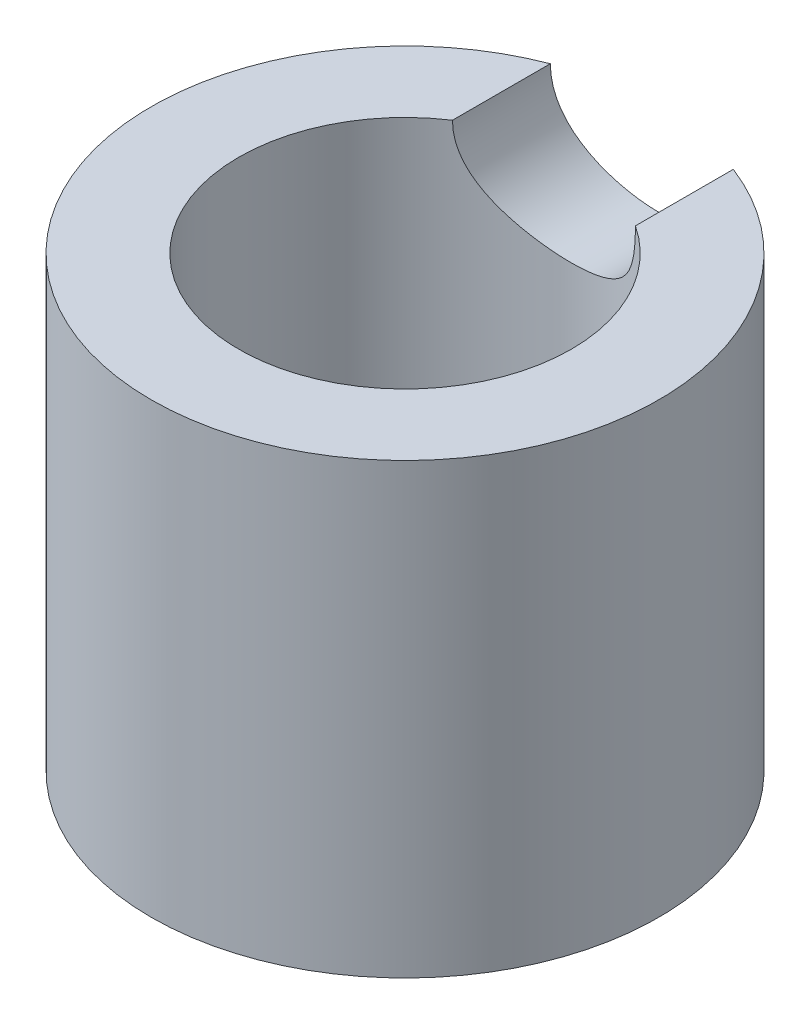
ISO-10303-21;
HEADER;
FILE_DESCRIPTION(('STEP AP214'),'2;1');
FILE_NAME('part.step','',(''),(''),'','','');
FILE_SCHEMA(('AUTOMOTIVE_DESIGN { 1 0 10303 214 1 1 1 1 }'));
ENDSEC;
DATA;
#1=APPLICATION_CONTEXT('core data for automotive mechanical design processes');
#2=APPLICATION_PROTOCOL_DEFINITION('international standard','automotive_design',2000,#1);
#3=PRODUCT_CONTEXT('',#1,'mechanical');
#4=PRODUCT('Part','Part','',(#3));
#5=PRODUCT_RELATED_PRODUCT_CATEGORY('part','',(#4));
#6=PRODUCT_DEFINITION_FORMATION('','',#4);
#7=PRODUCT_DEFINITION_CONTEXT('part definition',#1,'design');
#8=PRODUCT_DEFINITION('design','',#6,#7);
#9=PRODUCT_DEFINITION_SHAPE('','',#8);
#10=(LENGTH_UNIT() NAMED_UNIT(*) SI_UNIT(.MILLI.,.METRE.));
#11=(NAMED_UNIT(*) PLANE_ANGLE_UNIT() SI_UNIT($,.RADIAN.));
#12=(NAMED_UNIT(*) SI_UNIT($,.STERADIAN.) SOLID_ANGLE_UNIT());
#13=UNCERTAINTY_MEASURE_WITH_UNIT(LENGTH_MEASURE(1.E-05),#10,'distance_accuracy_value','');
#14=(GEOMETRIC_REPRESENTATION_CONTEXT(3) GLOBAL_UNCERTAINTY_ASSIGNED_CONTEXT((#13)) GLOBAL_UNIT_ASSIGNED_CONTEXT((#10,
#11,#12)) REPRESENTATION_CONTEXT('',''));
#15=CARTESIAN_POINT('',(0.,0.,0.));
#16=DIRECTION('',(0.,0.,1.));
#17=DIRECTION('',(1.,0.,0.));
#18=AXIS2_PLACEMENT_3D('',#15,#16,#17);
#19=CARTESIAN_POINT('',(0.,51.2,0.));
#20=DIRECTION('',(0.,1.,0.));
#21=DIRECTION('',(0.,0.,1.));
#22=AXIS2_PLACEMENT_3D('',#19,#20,#21);
#23=PLANE('',#22);
#24=DIRECTION('',(0.,0.,1.));
#25=VECTOR('',#24,1.);
#26=CARTESIAN_POINT('',(-10.45,51.2,-29.));
#27=LINE('',#26,#25);
#28=CARTESIAN_POINT('',(-10.45,51.2,-27.0517559504));
#29=VERTEX_POINT('',#28);
#30=CARTESIAN_POINT('',(-10.45,51.2,-15.8681284340656));
#31=VERTEX_POINT('',#30);
#32=EDGE_CURVE('E62',#29,#31,#27,.T.);
#33=ORIENTED_EDGE('',*,*,#32,.F.);
#34=CARTESIAN_POINT('',(0.,51.2,0.));
#35=DIRECTION('',(0.,1.,0.));
#36=DIRECTION('',(0.,0.,1.));
#37=AXIS2_PLACEMENT_3D('',#34,#35,#36);
#38=CIRCLE('',#37,29.);
#39=CARTESIAN_POINT('',(10.45,51.2,-27.0517559504));
#40=VERTEX_POINT('',#39);
#41=EDGE_CURVE('E85',#29,#40,#38,.T.);
#42=ORIENTED_EDGE('',*,*,#41,.T.);
#43=DIRECTION('',(0.,0.,1.));
#44=VECTOR('',#43,1.);
#45=CARTESIAN_POINT('',(10.45,51.2,-29.));
#46=LINE('',#45,#44);
#47=CARTESIAN_POINT('',(10.45,51.2,-15.8681284340656));
#48=VERTEX_POINT('',#47);
#49=EDGE_CURVE('E121',#48,#40,#46,.F.);
#50=ORIENTED_EDGE('',*,*,#49,.F.);
#51=CARTESIAN_POINT('',(0.,51.2,0.));
#52=DIRECTION('',(0.,1.,0.));
#53=DIRECTION('',(0.,0.,1.));
#54=AXIS2_PLACEMENT_3D('',#51,#52,#53);
#55=CIRCLE('',#54,19.);
#56=EDGE_CURVE('E94',#31,#48,#55,.T.);
#57=ORIENTED_EDGE('',*,*,#56,.F.);
#58=EDGE_LOOP('',(#33,#42,#50,#57));
#59=FACE_BOUND('',#58,.T.);
#60=ADVANCED_FACE('F33',(#59),#23,.T.);
#61=CARTESIAN_POINT('',(0.,0.,0.));
#62=DIRECTION('',(0.,1.,0.));
#63=DIRECTION('',(0.,0.,1.));
#64=AXIS2_PLACEMENT_3D('',#61,#62,#63);
#65=PLANE('',#64);
#66=CARTESIAN_POINT('',(0.,0.,0.));
#67=DIRECTION('',(0.,1.,0.));
#68=DIRECTION('',(0.,0.,1.));
#69=AXIS2_PLACEMENT_3D('',#66,#67,#68);
#70=CIRCLE('',#69,29.);
#71=CARTESIAN_POINT('',(-10.45,0.,-27.0517559504));
#72=VERTEX_POINT('',#71);
#73=CARTESIAN_POINT('',(10.45,0.,-27.0517559504));
#74=VERTEX_POINT('',#73);
#75=EDGE_CURVE('E90',#72,#74,#70,.T.);
#76=ORIENTED_EDGE('',*,*,#75,.F.);
#77=DIRECTION('',(0.,0.,1.));
#78=VECTOR('',#77,1.);
#79=CARTESIAN_POINT('',(-10.45,0.,-29.));
#80=LINE('',#79,#78);
#81=CARTESIAN_POINT('',(-10.45,0.,-15.8681284340656));
#82=VERTEX_POINT('',#81);
#83=EDGE_CURVE('E80',#72,#82,#80,.T.);
#84=ORIENTED_EDGE('',*,*,#83,.T.);
#85=CARTESIAN_POINT('',(0.,0.,0.));
#86=DIRECTION('',(0.,1.,0.));
#87=DIRECTION('',(0.,0.,1.));
#88=AXIS2_PLACEMENT_3D('',#85,#86,#87);
#89=CIRCLE('',#88,19.);
#90=CARTESIAN_POINT('',(10.45,0.,-15.8681284340656));
#91=VERTEX_POINT('',#90);
#92=EDGE_CURVE('E88',#82,#91,#89,.T.);
#93=ORIENTED_EDGE('',*,*,#92,.T.);
#94=DIRECTION('',(0.,0.,1.));
#95=VECTOR('',#94,1.);
#96=CARTESIAN_POINT('',(10.45,0.,-29.));
#97=LINE('',#96,#95);
#98=EDGE_CURVE('E55',#91,#74,#97,.F.);
#99=ORIENTED_EDGE('',*,*,#98,.T.);
#100=EDGE_LOOP('',(#76,#84,#93,#99));
#101=FACE_BOUND('',#100,.T.);
#102=ADVANCED_FACE('F87',(#101),#65,.F.);
#103=CARTESIAN_POINT('',(0.,51.2,0.));
#104=DIRECTION('',(0.,-1.,0.));
#105=DIRECTION('',(0.,0.,-1.));
#106=AXIS2_PLACEMENT_3D('',#103,#104,#105);
#107=CYLINDRICAL_SURFACE('',#106,29.);
#108=ORIENTED_EDGE('',*,*,#41,.F.);
#109=CARTESIAN_POINT('',(-10.45,51.2,-27.0517559504));
#110=CARTESIAN_POINT('',(-10.4500420347106,50.9164141954072,-27.0517043468938));
#111=CARTESIAN_POINT('',(-10.4384582900409,50.6328484891242,-27.0562135064838));
#112=CARTESIAN_POINT('',(-10.3923533101106,50.0679492759978,-27.0739748153919));
#113=CARTESIAN_POINT('',(-10.3578392161113,49.7866151017773,-27.0872242426955));
#114=CARTESIAN_POINT('',(-10.2663397274534,49.2291208230481,-27.1220299848386));
#115=CARTESIAN_POINT('',(-10.2094294851695,48.9529466172667,-27.1435585129282));
#116=CARTESIAN_POINT('',(-10.0736989221395,48.4067456528368,-27.1942248619088));
#117=CARTESIAN_POINT('',(-9.99487760715423,48.1367191737498,-27.2233630280918));
#118=CARTESIAN_POINT('',(-9.81612541506079,47.604890681953,-27.2883252534546));
#119=CARTESIAN_POINT('',(-9.71621576569784,47.3430807005817,-27.3241425851209));
#120=CARTESIAN_POINT('',(-9.49602608490442,46.8289327238641,-27.4014434152163));
#121=CARTESIAN_POINT('',(-9.37573845850375,46.5765983030991,-27.4429290251205));
#122=CARTESIAN_POINT('',(-9.11565980665933,46.0828580662941,-27.5304116973908));
#123=CARTESIAN_POINT('',(-8.97585950061417,45.8414575234053,-27.5764109033989));
#124=CARTESIAN_POINT('',(-8.67774496392955,45.371038312997,-27.6716682434378));
#125=CARTESIAN_POINT('',(-8.51942948657004,45.1420204807881,-27.7209265968263));
#126=CARTESIAN_POINT('',(-8.17835321787669,44.6884057396902,-27.8235070049463));
#127=CARTESIAN_POINT('',(-7.99485172295565,44.4643844132757,-27.8769128700475));
#128=CARTESIAN_POINT('',(-7.60999364051447,44.0324216665352,-27.984422606139));
#129=CARTESIAN_POINT('',(-7.40863666352119,43.8244805971454,-28.038526492333));
#130=CARTESIAN_POINT('',(-6.989224552279,43.4258793935119,-28.1460051192097));
#131=CARTESIAN_POINT('',(-6.77116606714592,43.2352227439477,-28.1993797110269));
#132=CARTESIAN_POINT('',(-6.31966720373455,42.8724451862077,-28.30398376654));
#133=CARTESIAN_POINT('',(-6.08622729607372,42.700323711345,-28.355213295789));
#134=CARTESIAN_POINT('',(-5.59776540045548,42.3706717808932,-28.4557396366489));
#135=CARTESIAN_POINT('',(-5.34229576701858,42.213769667686,-28.5049251534369));
#136=CARTESIAN_POINT('',(-4.81819953670833,41.9222128334194,-28.598177522385));
#137=CARTESIAN_POINT('',(-4.54957824539634,41.7875492353605,-28.6422464148639));
#138=CARTESIAN_POINT('',(-4.00093046659109,41.5415619344381,-28.7240224277536));
#139=CARTESIAN_POINT('',(-3.72090469945482,41.4302367601392,-28.7617299492052));
#140=CARTESIAN_POINT('',(-3.15147124006535,41.231970836778,-28.829679557322));
#141=CARTESIAN_POINT('',(-2.86206402532538,41.1450288487852,-28.8599220232835));
#142=CARTESIAN_POINT('',(-2.2878549349811,40.9993921327907,-28.9109917080171));
#143=CARTESIAN_POINT('',(-2.00333408881766,40.9397041116403,-28.9321479733921));
#144=CARTESIAN_POINT('',(-1.42982129044733,40.8441991641431,-28.9661546281748));
#145=CARTESIAN_POINT('',(-1.1408294473127,40.8083816563995,-28.9790052198775));
#146=CARTESIAN_POINT('',(-0.560678879709498,40.7609949871443,-28.9960313858068));
#147=CARTESIAN_POINT('',(-0.269520689891145,40.7494200296107,-29.0002090335992));
#148=CARTESIAN_POINT('',(0.312734806425997,40.7506246465023,-28.9997748676108));
#149=CARTESIAN_POINT('',(0.603832114382951,40.7634035489806,-28.9951632963333));
#150=CARTESIAN_POINT('',(1.17038196262185,40.8120354464162,-28.9776953432902));
#151=CARTESIAN_POINT('',(1.44594031930987,40.8468046299265,-28.9652263232188));
#152=CARTESIAN_POINT('',(1.99297364278444,40.9380584371896,-28.9327345282788));
#153=CARTESIAN_POINT('',(2.26444875680151,40.9945422760117,-28.9127120264502));
#154=CARTESIAN_POINT('',(2.80148216586523,41.1287138066125,-28.865625989761));
#155=CARTESIAN_POINT('',(3.06704032483467,41.2064019855021,-28.8385622931492));
#156=CARTESIAN_POINT('',(3.59051770846456,41.3823153444254,-28.7780752435371));
#157=CARTESIAN_POINT('',(3.84843674464675,41.480541030695,-28.7446517337734));
#158=CARTESIAN_POINT('',(4.35857346083339,41.6982467749626,-28.6717657468143));
#159=CARTESIAN_POINT('',(4.61066189598389,41.8180035257151,-28.6322257208561));
#160=CARTESIAN_POINT('',(5.10393720166782,42.0769548805522,-28.5484227923349));
#161=CARTESIAN_POINT('',(5.34512009308556,42.2161565049481,-28.5041581853929));
#162=CARTESIAN_POINT('',(5.8151378714156,42.5130019144401,-28.411996307252));
#163=CARTESIAN_POINT('',(6.04397205581615,42.6706467471483,-28.3640988297529));
#164=CARTESIAN_POINT('',(6.48804335191334,43.0033677864734,-28.2658277976439));
#165=CARTESIAN_POINT('',(6.70327959286285,43.1784451075379,-28.2154540848342));
#166=CARTESIAN_POINT('',(7.13029934974789,43.5549560262958,-28.1106697752737));
#167=CARTESIAN_POINT('',(7.3412592784425,43.7573049611028,-28.0561885814523));
#168=CARTESIAN_POINT('',(7.74550895494482,44.1789671559337,-27.947288313059));
#169=CARTESIAN_POINT('',(7.9387981319775,44.3982809635103,-27.8928692405497));
#170=CARTESIAN_POINT('',(8.30657087260514,44.8526511640103,-27.7855645190033));
#171=CARTESIAN_POINT('',(8.48104707362154,45.0877136623549,-27.7326794761947));
#172=CARTESIAN_POINT('',(8.80993426692912,45.5721004668433,-27.6299610342489));
#173=CARTESIAN_POINT('',(8.96434614832552,45.8214241403297,-27.5801274999428));
#174=CARTESIAN_POINT('',(9.25486016428928,46.3379432978285,-27.4840217354911));
#175=CARTESIAN_POINT('',(9.39053562890229,46.6053960717039,-27.43784037231));
#176=CARTESIAN_POINT('',(9.63865789391978,47.1516996773991,-27.3516640412208));
#177=CARTESIAN_POINT('',(9.75111447705434,47.4305456493991,-27.311666469709));
#178=CARTESIAN_POINT('',(9.95170746000071,47.9974526394747,-27.2392162699204));
#179=CARTESIAN_POINT('',(10.0398714660334,48.2855027788086,-27.2067550839143));
#180=CARTESIAN_POINT('',(10.1911151141635,48.8688149965805,-27.1504632228316));
#181=CARTESIAN_POINT('',(10.2542061224131,49.1640737426149,-27.1266286375619));
#182=CARTESIAN_POINT('',(10.3527968321001,49.7485837187473,-27.0891570823594));
#183=CARTESIAN_POINT('',(10.3892264665924,50.037656165093,-27.0751771130261));
#184=CARTESIAN_POINT('',(10.43783778974,50.6178112310461,-27.0564531568833));
#185=CARTESIAN_POINT('',(10.4500455895101,50.9088913462169,-27.0516992245359));
#186=CARTESIAN_POINT('',(10.45,51.2,-27.0517559504));
#187=B_SPLINE_CURVE_WITH_KNOTS('',3,(#109,#110,#111,#112,#113,#114,#115,#116,#117,#118,#119,
#120,#121,#122,#123,#124,#125,#126,#127,#128,#129,#130,#131,#132,#133,#134,#135,#136,#137,#138,
#139,#140,#141,#142,#143,#144,#145,#146,#147,#148,#149,#150,#151,#152,#153,#154,#155,#156,#157,
#158,#159,#160,#161,#162,#163,#164,#165,#166,#167,#168,#169,#170,#171,#172,#173,#174,#175,#176,
#177,#178,#179,#180,#181,#182,#183,#184,#185,#186),.UNSPECIFIED.,.F.,.F.,(4,2,2,2,2,2,2,2,2,2,2,
2,2,2,2,2,2,2,2,2,2,2,2,2,2,2,2,2,2,2,2,2,2,2,2,2,2,2,4),(0.,0.850453833766536,1.70064293244988,
2.54800314028429,3.39540180430426,4.24195150128672,5.08881740836093,5.93608748226968,
6.78341464003721,7.66582218735498,8.54824898694583,9.43085329714968,10.3134306152938,
11.223737519741,12.133680171924,13.0435654369885,13.9534044616266,14.8267426200457,
15.7000595064272,16.5731675722934,17.4462515486034,18.2793406273302,19.1123995947931,
19.9454777010853,20.7785763446223,21.6232656368351,22.4682606848241,23.3133037535895,
24.1584008801308,25.0494334564846,25.9404948035209,26.8319036170085,27.7232729162381,
28.6324226357712,29.5411885212372,30.4489173803231,31.3562342748872,32.230161380644,
33.1031458808551),.UNSPECIFIED.);
#188=EDGE_CURVE('E95',#29,#40,#187,.T.);
#189=ORIENTED_EDGE('',*,*,#188,.T.);
#190=EDGE_LOOP('',(#108,#189));
#191=FACE_BOUND('',#190,.T.);
#192=ORIENTED_EDGE('',*,*,#75,.T.);
#193=CARTESIAN_POINT('',(10.45,0.,-27.0517559504));
#194=CARTESIAN_POINT('',(10.4500420347106,0.283585804592823,-27.0517043468938));
#195=CARTESIAN_POINT('',(10.4384582900409,0.567151510875765,-27.0562135064838));
#196=CARTESIAN_POINT('',(10.3923533101106,1.13205072400223,-27.0739748153919));
#197=CARTESIAN_POINT('',(10.3578392161113,1.41338489822269,-27.0872242426955));
#198=CARTESIAN_POINT('',(10.2663397274534,1.97087917695194,-27.1220299848386));
#199=CARTESIAN_POINT('',(10.2094294851695,2.24705338273331,-27.1435585129283));
#200=CARTESIAN_POINT('',(10.0736989221395,2.79325434716323,-27.1942248619088));
#201=CARTESIAN_POINT('',(9.99487760715423,3.06328082625018,-27.2233630280918));
#202=CARTESIAN_POINT('',(9.81612541506079,3.59510931804701,-27.2883252534546));
#203=CARTESIAN_POINT('',(9.71621576569784,3.85691929941826,-27.3241425851209));
#204=CARTESIAN_POINT('',(9.49602608490443,4.37106727613591,-27.4014434152163));
#205=CARTESIAN_POINT('',(9.37573845850376,4.62340169690089,-27.4429290251205));
#206=CARTESIAN_POINT('',(9.11565980665934,5.11714193370589,-27.5304116973908));
#207=CARTESIAN_POINT('',(8.97585950061418,5.35854247659465,-27.5764109033989));
#208=CARTESIAN_POINT('',(8.67774496392956,5.82896168700296,-27.6716682434378));
#209=CARTESIAN_POINT('',(8.51942948657005,6.05797951921194,-27.7209265968263));
#210=CARTESIAN_POINT('',(8.1783532178767,6.51159426030976,-27.8235070049463));
#211=CARTESIAN_POINT('',(7.99485172295566,6.73561558672429,-27.8769128700475));
#212=CARTESIAN_POINT('',(7.60999364051448,7.16757833346485,-27.984422606139));
#213=CARTESIAN_POINT('',(7.4086366635212,7.37551940285456,-28.038526492333));
#214=CARTESIAN_POINT('',(6.98922455227901,7.77412060648809,-28.1460051192098));
#215=CARTESIAN_POINT('',(6.77116606714592,7.96477725605234,-28.1993797110269));
#216=CARTESIAN_POINT('',(6.31966720373456,8.32755481379228,-28.30398376654));
#217=CARTESIAN_POINT('',(6.08622729607372,8.49967628865505,-28.355213295789));
#218=CARTESIAN_POINT('',(5.59776540045549,8.82932821910676,-28.4557396366489));
#219=CARTESIAN_POINT('',(5.34229576701858,8.986230332314,-28.5049251534368));
#220=CARTESIAN_POINT('',(4.81819953670834,9.27778716658057,-28.598177522385));
#221=CARTESIAN_POINT('',(4.54957824539635,9.41245076463952,-28.6422464148639));
#222=CARTESIAN_POINT('',(4.0009304665911,9.65843806556188,-28.7240224277536));
#223=CARTESIAN_POINT('',(3.72090469945483,9.76976323986082,-28.7617299492052));
#224=CARTESIAN_POINT('',(3.15147124006535,9.96802916322205,-28.829679557322));
#225=CARTESIAN_POINT('',(2.86206402532538,10.0549711512148,-28.8599220232835));
#226=CARTESIAN_POINT('',(2.28785493498111,10.2006078672093,-28.9109917080171));
#227=CARTESIAN_POINT('',(2.00333408881766,10.2602958883597,-28.9321479733921));
#228=CARTESIAN_POINT('',(1.42982129044734,10.3558008358569,-28.9661546281748));
#229=CARTESIAN_POINT('',(1.14082944731271,10.3916183436005,-28.9790052198775));
#230=CARTESIAN_POINT('',(0.560678879709506,10.4390050128558,-28.9960313858068));
#231=CARTESIAN_POINT('',(0.269520689891153,10.4505799703893,-29.0002090335992));
#232=CARTESIAN_POINT('',(-0.31273480642599,10.4493753534977,-28.9997748676108));
#233=CARTESIAN_POINT('',(-0.603832114382944,10.4365964510194,-28.9951632963333));
#234=CARTESIAN_POINT('',(-1.17038196262185,10.3879645535838,-28.9776953432902));
#235=CARTESIAN_POINT('',(-1.44594031930986,10.3531953700735,-28.9652263232188));
#236=CARTESIAN_POINT('',(-1.99297364278444,10.2619415628104,-28.9327345282788));
#237=CARTESIAN_POINT('',(-2.2644487568015,10.2054577239883,-28.9127120264502));
#238=CARTESIAN_POINT('',(-2.80148216586523,10.0712861933875,-28.865625989761));
#239=CARTESIAN_POINT('',(-3.06704032483466,9.99359801449789,-28.8385622931492));
#240=CARTESIAN_POINT('',(-3.59051770846455,9.81768465557462,-28.7780752435371));
#241=CARTESIAN_POINT('',(-3.84843674464674,9.71945896930502,-28.7446517337734));
#242=CARTESIAN_POINT('',(-4.35857346083338,9.50175322503744,-28.6717657468143));
#243=CARTESIAN_POINT('',(-4.61066189598388,9.3819964742849,-28.6322257208561));
#244=CARTESIAN_POINT('',(-5.10393720166782,9.12304511944778,-28.5484227923349));
#245=CARTESIAN_POINT('',(-5.34512009308555,8.98384349505191,-28.5041581853929));
#246=CARTESIAN_POINT('',(-5.81513787141559,8.68699808555991,-28.411996307252));
#247=CARTESIAN_POINT('',(-6.04397205581614,8.52935325285172,-28.3640988297529));
#248=CARTESIAN_POINT('',(-6.48804335191334,8.1966322135266,-28.2658277976439));
#249=CARTESIAN_POINT('',(-6.70327959286284,8.02155489246214,-28.2154540848342));
#250=CARTESIAN_POINT('',(-7.13029934974788,7.64504397370423,-28.1106697752738));
#251=CARTESIAN_POINT('',(-7.34125927844249,7.44269503889725,-28.0561885814523));
#252=CARTESIAN_POINT('',(-7.74550895494482,7.02103284406633,-27.947288313059));
#253=CARTESIAN_POINT('',(-7.9387981319775,6.80171903648976,-27.8928692405497));
#254=CARTESIAN_POINT('',(-8.30657087260514,6.34734883598967,-27.7855645190033));
#255=CARTESIAN_POINT('',(-8.48104707362154,6.11228633764513,-27.7326794761947));
#256=CARTESIAN_POINT('',(-8.80993426692911,5.62789953315669,-27.6299610342489));
#257=CARTESIAN_POINT('',(-8.96434614832551,5.3785758596703,-27.5801274999428));
#258=CARTESIAN_POINT('',(-9.25486016428927,4.86205670217147,-27.4840217354911));
#259=CARTESIAN_POINT('',(-9.39053562890229,4.59460392829616,-27.43784037231));
#260=CARTESIAN_POINT('',(-9.63865789391978,4.04830032260089,-27.3516640412208));
#261=CARTESIAN_POINT('',(-9.75111447705434,3.76945435060087,-27.311666469709));
#262=CARTESIAN_POINT('',(-9.9517074600007,3.20254736052535,-27.2392162699204));
#263=CARTESIAN_POINT('',(-10.0398714660334,2.91449722119139,-27.2067550839143));
#264=CARTESIAN_POINT('',(-10.1911151141635,2.33118500341955,-27.1504632228316));
#265=CARTESIAN_POINT('',(-10.2542061224131,2.03592625738507,-27.1266286375619));
#266=CARTESIAN_POINT('',(-10.3527968321001,1.45141628125275,-27.0891570823594));
#267=CARTESIAN_POINT('',(-10.3892264665924,1.16234383490704,-27.0751771130261));
#268=CARTESIAN_POINT('',(-10.43783778974,0.58218876895395,-27.0564531568833));
#269=CARTESIAN_POINT('',(-10.4500455895101,0.291108653783103,-27.0516992245359));
#270=CARTESIAN_POINT('',(-10.45,0.,-27.0517559504));
#271=B_SPLINE_CURVE_WITH_KNOTS('',3,(#193,#194,#195,#196,#197,#198,#199,#200,#201,#202,#203,
#204,#205,#206,#207,#208,#209,#210,#211,#212,#213,#214,#215,#216,#217,#218,#219,#220,#221,#222,
#223,#224,#225,#226,#227,#228,#229,#230,#231,#232,#233,#234,#235,#236,#237,#238,#239,#240,#241,
#242,#243,#244,#245,#246,#247,#248,#249,#250,#251,#252,#253,#254,#255,#256,#257,#258,#259,#260,
#261,#262,#263,#264,#265,#266,#267,#268,#269,#270),.UNSPECIFIED.,.F.,.F.,(4,2,2,2,2,2,2,2,2,2,2,
2,2,2,2,2,2,2,2,2,2,2,2,2,2,2,2,2,2,2,2,2,2,2,2,2,2,2,4),(0.,0.850453833766532,1.70064293244988,
2.54800314028428,3.39540180430426,4.24195150128671,5.08881740836092,5.93608748226966,
6.7834146400372,7.66582218735498,8.54824898694583,9.43085329714968,10.3134306152938,
11.223737519741,12.133680171924,13.0435654369885,13.9534044616266,14.8267426200457,
15.7000595064273,16.5731675722934,17.4462515486034,18.2793406273302,19.1123995947931,
19.9454777010853,20.7785763446223,21.6232656368351,22.4682606848241,23.3133037535895,
24.1584008801308,25.0494334564846,25.9404948035209,26.8319036170085,27.7232729162381,
28.6324226357712,29.5411885212372,30.4489173803231,31.3562342748872,32.230161380644,
33.1031458808552),.UNSPECIFIED.);
#272=EDGE_CURVE('E91',#74,#72,#271,.T.);
#273=ORIENTED_EDGE('',*,*,#272,.T.);
#274=EDGE_LOOP('',(#192,#273));
#275=FACE_BOUND('',#274,.T.);
#276=ADVANCED_FACE('F35',(#191,#275),#107,.T.);
#277=CARTESIAN_POINT('',(0.,51.2,0.));
#278=DIRECTION('',(0.,-1.,0.));
#279=DIRECTION('',(0.,0.,-1.));
#280=AXIS2_PLACEMENT_3D('',#277,#278,#279);
#281=CYLINDRICAL_SURFACE('',#280,19.);
#282=CARTESIAN_POINT('',(-10.45,51.2,-15.8681284340656));
#283=CARTESIAN_POINT('',(-10.4500012730181,51.0653833149891,-15.8681246559729));
#284=CARTESIAN_POINT('',(-10.4473981935161,50.9307864478376,-15.8698422115779));
#285=CARTESIAN_POINT('',(-10.4370032538798,50.6618869862102,-15.8766816326083));
#286=CARTESIAN_POINT('',(-10.4292116748264,50.5275843761886,-15.8818033136192));
#287=CARTESIAN_POINT('',(-10.3981046596639,50.1257493900968,-15.9022035166576));
#288=CARTESIAN_POINT('',(-10.3670568574151,49.8590162589393,-15.9225173529007));
#289=CARTESIAN_POINT('',(-10.2850919997626,49.3318171395036,-15.9755820898262));
#290=CARTESIAN_POINT('',(-10.2343115002847,49.0713208671769,-16.0082474732981));
#291=CARTESIAN_POINT('',(-10.1135634255716,48.5564693719258,-16.0848045161732));
#292=CARTESIAN_POINT('',(-10.0435929241274,48.3021150920111,-16.12869788762));
#293=CARTESIAN_POINT('',(-9.88553018246522,47.8018502283056,-16.2260552771701));
#294=CARTESIAN_POINT('',(-9.79749089995467,47.5559173660677,-16.2794912687168));
#295=CARTESIAN_POINT('',(-9.60403995683278,47.0729436946843,-16.3943606685431));
#296=CARTESIAN_POINT('',(-9.49862864822693,46.8359027054843,-16.4557939147708));
#297=CARTESIAN_POINT('',(-9.27108162313205,46.3712752819912,-16.5850592272797));
#298=CARTESIAN_POINT('',(-9.14891684383235,46.1437061932698,-16.6529023479392));
#299=CARTESIAN_POINT('',(-8.88879269546811,45.6992566003047,-16.7931891214218));
#300=CARTESIAN_POINT('',(-8.75083177189294,45.482377151046,-16.8656332267182));
#301=CARTESIAN_POINT('',(-8.44524660649842,45.0388371524624,-17.0208707913538));
#302=CARTESIAN_POINT('',(-8.27603504615457,44.813377165401,-17.1039735239912));
#303=CARTESIAN_POINT('',(-7.92025692286623,44.3771517454434,-17.2716010378501));
#304=CARTESIAN_POINT('',(-7.73368933213889,44.1663871840702,-17.356125903044));
#305=CARTESIAN_POINT('',(-7.34394254747332,43.7603610419234,-17.5245996758007));
#306=CARTESIAN_POINT('',(-7.14075577283886,43.5651066169124,-17.6085483013791));
#307=CARTESIAN_POINT('',(-6.71875429802651,43.1912371415642,-17.7738481776533));
#308=CARTESIAN_POINT('',(-6.49994473541626,43.0126166652579,-17.8552002696029));
#309=CARTESIAN_POINT('',(-6.02796580951804,42.6583052928639,-18.0203050555937));
#310=CARTESIAN_POINT('',(-5.77346113451381,42.4842006174535,-18.1036579714908));
#311=CARTESIAN_POINT('',(-5.24829903158589,42.1582431644075,-18.262821138262));
#312=CARTESIAN_POINT('',(-4.97764042634378,42.0063920114297,-18.3386308383007));
#313=CARTESIAN_POINT('',(-4.42196345972371,41.7265930463403,-18.4804871163755));
#314=CARTESIAN_POINT('',(-4.13695324241697,41.5986318672827,-18.5465391496878));
#315=CARTESIAN_POINT('',(-3.55446192453808,41.3680942773136,-18.6669279387466));
#316=CARTESIAN_POINT('',(-3.25698249065588,41.2655144863877,-18.7212662542732));
#317=CARTESIAN_POINT('',(-2.67716156036428,41.0946097581584,-18.8125395654125));
#318=CARTESIAN_POINT('',(-2.39561869371007,41.0241454583119,-18.8505461022332));
#319=CARTESIAN_POINT('',(-1.82629028871861,40.9067196174583,-18.9141925377618));
#320=CARTESIAN_POINT('',(-1.53850506778543,40.8597568843797,-18.9398330637093));
#321=CARTESIAN_POINT('',(-0.959332065107866,40.7900428826343,-18.9779834579204));
#322=CARTESIAN_POINT('',(-0.667946639160716,40.7672765502572,-18.9905014956532));
#323=CARTESIAN_POINT('',(-0.0840349414601812,40.7462559718408,-19.0020572982258));
#324=CARTESIAN_POINT('',(0.208491238125644,40.7479997849005,-19.0010961304523));
#325=CARTESIAN_POINT('',(0.761381928150848,40.7744937192387,-18.986537018077));
#326=CARTESIAN_POINT('',(1.02190258118581,40.796812366127,-18.97427465686));
#327=CARTESIAN_POINT('',(1.53982717952239,40.8607784045931,-18.9392788647418));
#328=CARTESIAN_POINT('',(1.79723139030732,40.9024241376779,-18.9165463323066));
#329=CARTESIAN_POINT('',(2.30717744119805,41.0045568521245,-18.8611432232997));
#330=CARTESIAN_POINT('',(2.5597191899388,41.0650441871515,-18.8284724601834));
#331=CARTESIAN_POINT('',(3.05834942150661,41.2042006089911,-18.7539343956568));
#332=CARTESIAN_POINT('',(3.30443765326291,41.2828704020179,-18.7120667370384));
#333=CARTESIAN_POINT('',(3.79129051288055,41.4585271755928,-18.6195639348381));
#334=CARTESIAN_POINT('',(4.03197210941065,41.5556978168595,-18.5688413468723));
#335=CARTESIAN_POINT('',(4.50414244029669,41.7669661949012,-18.4599953673567));
#336=CARTESIAN_POINT('',(4.73562783881112,41.881070004232,-18.4018693218507));
#337=CARTESIAN_POINT('',(5.18824121521788,42.1252674186986,-18.279417775016));
#338=CARTESIAN_POINT('',(5.40937044515481,42.2553590839996,-18.215093025991));
#339=CARTESIAN_POINT('',(5.8404943223379,42.5307105559795,-18.0814707607809));
#340=CARTESIAN_POINT('',(6.05048492934415,42.6759758105097,-18.0121714613699));
#341=CARTESIAN_POINT('',(6.48046570029448,42.9972185556614,-17.8622736907849));
#342=CARTESIAN_POINT('',(6.69910080414365,43.174818839879,-17.781261737982));
#343=CARTESIAN_POINT('',(7.12080538383843,43.546527105727,-17.6166222801085));
#344=CARTESIAN_POINT('',(7.32387371151187,43.7406363027964,-17.5329945827455));
#345=CARTESIAN_POINT('',(7.71384060763867,44.1446419237716,-17.3649587686544));
#346=CARTESIAN_POINT('',(7.90071979251649,44.3545567252083,-17.2805498467567));
#347=CARTESIAN_POINT('',(8.2572086769888,44.7890731994456,-17.1130738002932));
#348=CARTESIAN_POINT('',(8.42681820307708,45.0136750197678,-17.0300066892155));
#349=CARTESIAN_POINT('',(8.76216156562718,45.4972712232828,-16.8600984974949));
#350=CARTESIAN_POINT('',(8.92621372321557,45.7575485702563,-16.773577332291));
#351=CARTESIAN_POINT('',(9.23157338358674,46.293308113382,-16.6074766862903));
#352=CARTESIAN_POINT('',(9.37287755167582,46.5687925308484,-16.5278982240262));
#353=CARTESIAN_POINT('',(9.63098465736376,47.1327465828359,-16.3788369713242));
#354=CARTESIAN_POINT('',(9.74785006769433,47.4211807604486,-16.3093285822235));
#355=CARTESIAN_POINT('',(9.95602284359848,48.0097882905724,-16.1830919535635));
#356=CARTESIAN_POINT('',(10.0473407557039,48.309956740435,-16.1263584421653));
#357=CARTESIAN_POINT('',(10.1785121378221,48.8236751008197,-16.0437477570263));
#358=CARTESIAN_POINT('',(10.2255185262193,49.0347704625161,-16.0137780908027));
#359=CARTESIAN_POINT('',(10.3064606327971,49.4603823158968,-15.9618037153635));
#360=CARTESIAN_POINT('',(10.3404001006948,49.6748978077028,-15.9397967212684));
#361=CARTESIAN_POINT('',(10.3949890356453,50.1071568553254,-15.9042551230562));
#362=CARTESIAN_POINT('',(10.4155869370567,50.3249096474307,-15.8907533975621));
#363=CARTESIAN_POINT('',(10.443108726044,50.7617680737177,-15.8726660496449));
#364=CARTESIAN_POINT('',(10.4500248155989,50.9808744080409,-15.8680855119231));
#365=CARTESIAN_POINT('',(10.45,51.2,-15.8681284340656));
#366=B_SPLINE_CURVE_WITH_KNOTS('',3,(#282,#283,#284,#285,#286,#287,#288,#289,#290,#291,#292,
#293,#294,#295,#296,#297,#298,#299,#300,#301,#302,#303,#304,#305,#306,#307,#308,#309,#310,#311,
#312,#313,#314,#315,#316,#317,#318,#319,#320,#321,#322,#323,#324,#325,#326,#327,#328,#329,#330,
#331,#332,#333,#334,#335,#336,#337,#338,#339,#340,#341,#342,#343,#344,#345,#346,#347,#348,#349,
#350,#351,#352,#353,#354,#355,#356,#357,#358,#359,#360,#361,#362,#363,#364,#365),.UNSPECIFIED.,
.F.,.F.,(4,2,2,2,2,2,2,2,2,2,2,2,2,2,2,2,2,2,2,2,2,2,2,2,2,2,2,2,2,2,2,2,2,2,2,2,2,2,2,2,2,4),
(0.,0.403774900877862,0.807527929500475,1.61421634347208,2.41541890435949,3.21674370550549,
4.01575261388323,4.81474533411242,5.61514205241605,6.41561760618315,7.29637563173928,
8.17718584693271,9.05840010095439,9.93932588987509,10.896356113444,11.853456171935,
12.8100190971677,13.7664545692164,14.6433457334633,15.5201924145922,16.3964928857487,
17.2727239651172,18.0570787544756,18.8413662493439,19.6256684665201,20.4100011514402,
21.202569498715,21.9954227660016,22.7881799298052,23.5812227060215,24.4595921876933,
25.338026393811,26.2174982342825,27.0969789098323,28.0545593291095,29.0122799953022,
29.9675216788514,30.92236843516,31.5768566276699,32.2311568663348,32.8879711427837,
33.5451596662769),.UNSPECIFIED.);
#367=EDGE_CURVE('E11',#31,#48,#366,.T.);
#368=ORIENTED_EDGE('',*,*,#367,.F.);
#369=ORIENTED_EDGE('',*,*,#56,.T.);
#370=EDGE_LOOP('',(#368,#369));
#371=FACE_BOUND('',#370,.T.);
#372=CARTESIAN_POINT('',(10.45,0.,-15.8681284340656));
#373=CARTESIAN_POINT('',(10.4500012730181,0.13461668501087,-15.8681246559729));
#374=CARTESIAN_POINT('',(10.4473981935161,0.269213552162404,-15.8698422115779));
#375=CARTESIAN_POINT('',(10.4370032538798,0.53811301378984,-15.8766816326083));
#376=CARTESIAN_POINT('',(10.4292116748264,0.672415623811373,-15.8818033136192));
#377=CARTESIAN_POINT('',(10.3981046596639,1.07425060990325,-15.9022035166576));
#378=CARTESIAN_POINT('',(10.3670568574151,1.34098374106069,-15.9225173529007));
#379=CARTESIAN_POINT('',(10.2850919997626,1.86818286049645,-15.9755820898262));
#380=CARTESIAN_POINT('',(10.2343115002847,2.12867913282309,-16.0082474732981));
#381=CARTESIAN_POINT('',(10.1135634255716,2.6435306280742,-16.0848045161732));
#382=CARTESIAN_POINT('',(10.0435929241274,2.89788490798894,-16.1286978876201));
#383=CARTESIAN_POINT('',(9.88553018246523,3.39814977169438,-16.2260552771701));
#384=CARTESIAN_POINT('',(9.79749089995467,3.64408263393227,-16.2794912687168));
#385=CARTESIAN_POINT('',(9.60403995683278,4.12705630531565,-16.3943606685431));
#386=CARTESIAN_POINT('',(9.49862864822693,4.36409729451573,-16.4557939147708));
#387=CARTESIAN_POINT('',(9.27108162313205,4.82872471800875,-16.5850592272797));
#388=CARTESIAN_POINT('',(9.14891684383235,5.0562938067302,-16.6529023479392));
#389=CARTESIAN_POINT('',(8.88879269546811,5.50074339969534,-16.7931891214218));
#390=CARTESIAN_POINT('',(8.75083177189294,5.71762284895399,-16.8656332267182));
#391=CARTESIAN_POINT('',(8.44524660649842,6.16116284753757,-17.0208707913538));
#392=CARTESIAN_POINT('',(8.27603504615457,6.38662283459905,-17.1039735239912));
#393=CARTESIAN_POINT('',(7.92025692286624,6.82284825455657,-17.2716010378501));
#394=CARTESIAN_POINT('',(7.73368933213889,7.03361281592981,-17.356125903044));
#395=CARTESIAN_POINT('',(7.34394254747332,7.43963895807659,-17.5245996758007));
#396=CARTESIAN_POINT('',(7.14075577283886,7.63489338308758,-17.6085483013791));
#397=CARTESIAN_POINT('',(6.71875429802652,8.00876285843584,-17.7738481776533));
#398=CARTESIAN_POINT('',(6.49994473541626,8.18738333474212,-17.8552002696029));
#399=CARTESIAN_POINT('',(6.02796580951805,8.54169470713606,-18.0203050555937));
#400=CARTESIAN_POINT('',(5.77346113451382,8.71579938254646,-18.1036579714908));
#401=CARTESIAN_POINT('',(5.2482990315859,9.04175683559255,-18.262821138262));
#402=CARTESIAN_POINT('',(4.97764042634378,9.19360798857028,-18.3386308383007));
#403=CARTESIAN_POINT('',(4.42196345972371,9.47340695365971,-18.4804871163755));
#404=CARTESIAN_POINT('',(4.13695324241697,9.60136813271735,-18.5465391496878));
#405=CARTESIAN_POINT('',(3.55446192453809,9.83190572268642,-18.6669279387466));
#406=CARTESIAN_POINT('',(3.25698249065589,9.93448551361228,-18.7212662542732));
#407=CARTESIAN_POINT('',(2.67716156036429,10.1053902418416,-18.8125395654125));
#408=CARTESIAN_POINT('',(2.39561869371007,10.1758545416881,-18.8505461022332));
#409=CARTESIAN_POINT('',(1.82629028871862,10.2932803825418,-18.9141925377618));
#410=CARTESIAN_POINT('',(1.53850506778544,10.3402431156203,-18.9398330637093));
#411=CARTESIAN_POINT('',(0.959332065107871,10.4099571173657,-18.9779834579204));
#412=CARTESIAN_POINT('',(0.667946639160721,10.4327234497428,-18.9905014956532));
#413=CARTESIAN_POINT('',(0.0840349414601844,10.4537440281592,-19.0020572982258));
#414=CARTESIAN_POINT('',(-0.208491238125641,10.4520002150995,-19.0010961304523));
#415=CARTESIAN_POINT('',(-0.761381928150845,10.4255062807613,-18.986537018077));
#416=CARTESIAN_POINT('',(-1.02190258118581,10.403187633873,-18.97427465686));
#417=CARTESIAN_POINT('',(-1.53982717952239,10.3392215954069,-18.9392788647418));
#418=CARTESIAN_POINT('',(-1.79723139030732,10.2975758623221,-18.9165463323066));
#419=CARTESIAN_POINT('',(-2.30717744119805,10.1954431478755,-18.8611432232997));
#420=CARTESIAN_POINT('',(-2.55971918993879,10.1349558128485,-18.8284724601834));
#421=CARTESIAN_POINT('',(-3.05834942150661,9.9957993910089,-18.7539343956568));
#422=CARTESIAN_POINT('',(-3.30443765326291,9.9171295979821,-18.7120667370384));
#423=CARTESIAN_POINT('',(-3.79129051288054,9.74147282440722,-18.6195639348381));
#424=CARTESIAN_POINT('',(-4.03197210941065,9.64430218314055,-18.5688413468723));
#425=CARTESIAN_POINT('',(-4.50414244029669,9.4330338050988,-18.4599953673567));
#426=CARTESIAN_POINT('',(-4.73562783881112,9.31892999576797,-18.4018693218507));
#427=CARTESIAN_POINT('',(-5.18824121521788,9.07473258130145,-18.279417775016));
#428=CARTESIAN_POINT('',(-5.40937044515481,8.94464091600042,-18.215093025991));
#429=CARTESIAN_POINT('',(-5.8404943223379,8.66928944402046,-18.0814707607809));
#430=CARTESIAN_POINT('',(-6.05048492934414,8.52402418949034,-18.0121714613699));
#431=CARTESIAN_POINT('',(-6.48046570029448,8.2027814443386,-17.8622736907849));
#432=CARTESIAN_POINT('',(-6.69910080414365,8.02518116012106,-17.781261737982));
#433=CARTESIAN_POINT('',(-7.12080538383843,7.65347289427305,-17.6166222801085));
#434=CARTESIAN_POINT('',(-7.32387371151187,7.45936369720356,-17.5329945827455));
#435=CARTESIAN_POINT('',(-7.71384060763867,7.0553580762284,-17.3649587686544));
#436=CARTESIAN_POINT('',(-7.90071979251648,6.84544327479169,-17.2805498467567));
#437=CARTESIAN_POINT('',(-8.2572086769888,6.41092680055438,-17.1130738002932));
#438=CARTESIAN_POINT('',(-8.42681820307707,6.18632498023224,-17.0300066892155));
#439=CARTESIAN_POINT('',(-8.76216156562717,5.7027287767172,-16.8600984974949));
#440=CARTESIAN_POINT('',(-8.92621372321557,5.44245142974372,-16.773577332291));
#441=CARTESIAN_POINT('',(-9.23157338358674,4.90669188661799,-16.6074766862903));
#442=CARTESIAN_POINT('',(-9.37287755167582,4.63120746915157,-16.5278982240262));
#443=CARTESIAN_POINT('',(-9.63098465736375,4.06725341716414,-16.3788369713242));
#444=CARTESIAN_POINT('',(-9.74785006769433,3.77881923955142,-16.3093285822235));
#445=CARTESIAN_POINT('',(-9.95602284359849,3.1902117094276,-16.1830919535635));
#446=CARTESIAN_POINT('',(-10.0473407557039,2.89004325956497,-16.1263584421653));
#447=CARTESIAN_POINT('',(-10.1785121378221,2.37632489918034,-16.0437477570263));
#448=CARTESIAN_POINT('',(-10.2255185262193,2.16522953748394,-16.0137780908027));
#449=CARTESIAN_POINT('',(-10.3064606327971,1.73961768410317,-15.9618037153635));
#450=CARTESIAN_POINT('',(-10.3404001006948,1.52510219229721,-15.9397967212684));
#451=CARTESIAN_POINT('',(-10.3949890356453,1.09284314467457,-15.9042551230562));
#452=CARTESIAN_POINT('',(-10.4155869370567,0.875090352569285,-15.8907533975621));
#453=CARTESIAN_POINT('',(-10.443108726044,0.438231926282305,-15.8726660496449));
#454=CARTESIAN_POINT('',(-10.4500248155989,0.219125591959078,-15.8680855119231));
#455=CARTESIAN_POINT('',(-10.45,0.,-15.8681284340656));
#456=B_SPLINE_CURVE_WITH_KNOTS('',3,(#372,#373,#374,#375,#376,#377,#378,#379,#380,#381,#382,
#383,#384,#385,#386,#387,#388,#389,#390,#391,#392,#393,#394,#395,#396,#397,#398,#399,#400,#401,
#402,#403,#404,#405,#406,#407,#408,#409,#410,#411,#412,#413,#414,#415,#416,#417,#418,#419,#420,
#421,#422,#423,#424,#425,#426,#427,#428,#429,#430,#431,#432,#433,#434,#435,#436,#437,#438,#439,
#440,#441,#442,#443,#444,#445,#446,#447,#448,#449,#450,#451,#452,#453,#454,#455),.UNSPECIFIED.,
.F.,.F.,(4,2,2,2,2,2,2,2,2,2,2,2,2,2,2,2,2,2,2,2,2,2,2,2,2,2,2,2,2,2,2,2,2,2,2,2,2,2,2,2,2,4),
(0.,0.403774900877858,0.807527929500476,1.61421634347208,2.41541890435949,3.21674370550549,
4.01575261388323,4.81474533411241,5.61514205241605,6.41561760618316,7.29637563173929,
8.17718584693272,9.05840010095439,9.93932588987509,10.896356113444,11.853456171935,
12.8100190971677,13.7664545692164,14.6433457334633,15.5201924145922,16.3964928857487,
17.2727239651172,18.0570787544756,18.8413662493439,19.6256684665201,20.4100011514402,
21.202569498715,21.9954227660016,22.7881799298052,23.5812227060215,24.4595921876933,
25.338026393811,26.2174982342825,27.0969789098324,28.0545593291095,29.0122799953022,
29.9675216788514,30.92236843516,31.5768566276699,32.2311568663348,32.8879711427837,
33.5451596662769),.UNSPECIFIED.);
#457=EDGE_CURVE('E48',#91,#82,#456,.T.);
#458=ORIENTED_EDGE('',*,*,#457,.F.);
#459=ORIENTED_EDGE('',*,*,#92,.F.);
#460=EDGE_LOOP('',(#458,#459));
#461=FACE_BOUND('',#460,.T.);
#462=ADVANCED_FACE('F93',(#371,#461),#281,.F.);
#463=CARTESIAN_POINT('',(0.,0.,-29.));
#464=DIRECTION('',(0.,0.,1.));
#465=DIRECTION('',(1.,0.,0.));
#466=AXIS2_PLACEMENT_3D('',#463,#464,#465);
#467=CYLINDRICAL_SURFACE('',#466,10.45);
#468=ORIENTED_EDGE('',*,*,#98,.F.);
#469=ORIENTED_EDGE('',*,*,#457,.T.);
#470=ORIENTED_EDGE('',*,*,#83,.F.);
#471=ORIENTED_EDGE('',*,*,#272,.F.);
#472=EDGE_LOOP('',(#468,#469,#470,#471));
#473=FACE_BOUND('',#472,.T.);
#474=ADVANCED_FACE('F79',(#473),#467,.F.);
#475=CARTESIAN_POINT('',(0.,51.2,-29.));
#476=DIRECTION('',(0.,0.,1.));
#477=DIRECTION('',(1.,0.,0.));
#478=AXIS2_PLACEMENT_3D('',#475,#476,#477);
#479=CYLINDRICAL_SURFACE('',#478,10.45);
#480=ORIENTED_EDGE('',*,*,#32,.T.);
#481=ORIENTED_EDGE('',*,*,#367,.T.);
#482=ORIENTED_EDGE('',*,*,#49,.T.);
#483=ORIENTED_EDGE('',*,*,#188,.F.);
#484=EDGE_LOOP('',(#480,#481,#482,#483));
#485=FACE_BOUND('',#484,.T.);
#486=ADVANCED_FACE('F112',(#485),#479,.F.);
#487=CLOSED_SHELL('',(#60,#102,#276,#462,#474,#486));
#488=MANIFOLD_SOLID_BREP('B2',#487);
#489=ADVANCED_BREP_SHAPE_REPRESENTATION('',(#18,#488),#14);
#490=SHAPE_DEFINITION_REPRESENTATION(#9,#489);
ENDSEC;
END-ISO-10303-21;
